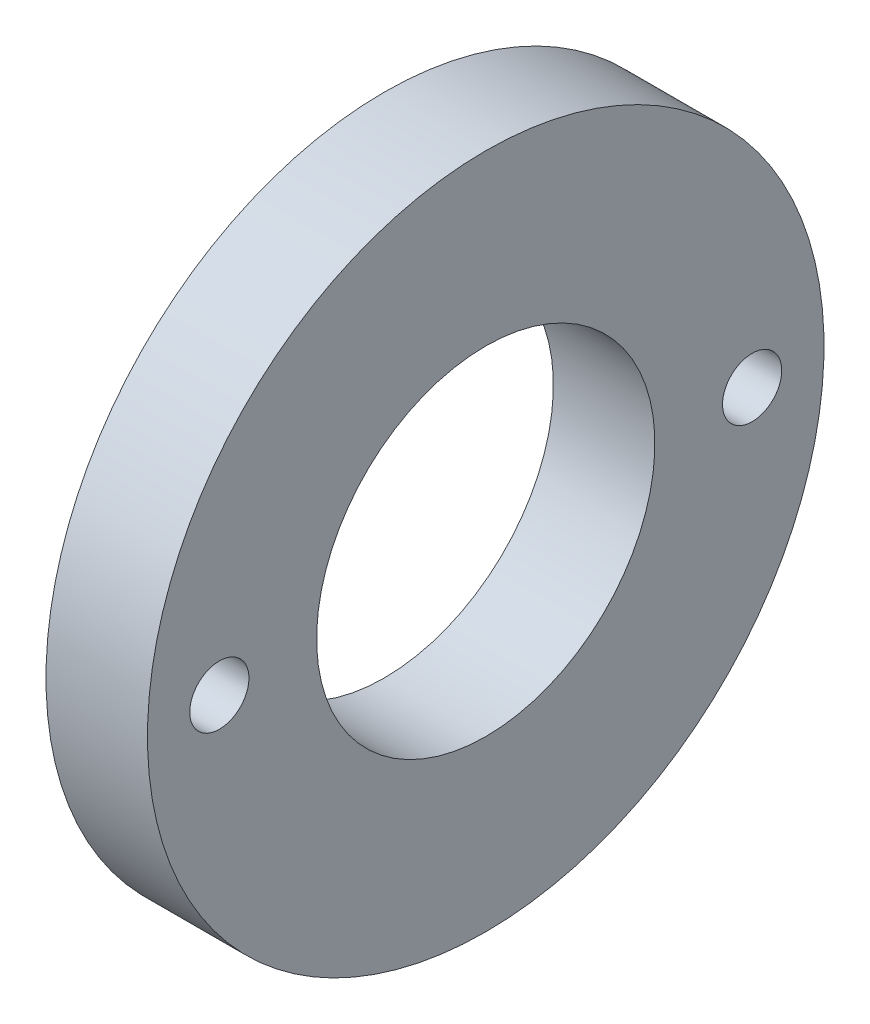
ISO-10303-21;
HEADER;
FILE_DESCRIPTION(('STEP AP214'),'2;1');
FILE_NAME('part.step','',(''),(''),'','','');
FILE_SCHEMA(('AUTOMOTIVE_DESIGN { 1 0 10303 214 1 1 1 1 }'));
ENDSEC;
DATA;
#1=APPLICATION_CONTEXT('core data for automotive mechanical design processes');
#2=APPLICATION_PROTOCOL_DEFINITION('international standard','automotive_design',2000,#1);
#3=PRODUCT_CONTEXT('',#1,'mechanical');
#4=PRODUCT('Part','Part','',(#3));
#5=PRODUCT_RELATED_PRODUCT_CATEGORY('part','',(#4));
#6=PRODUCT_DEFINITION_FORMATION('','',#4);
#7=PRODUCT_DEFINITION_CONTEXT('part definition',#1,'design');
#8=PRODUCT_DEFINITION('design','',#6,#7);
#9=PRODUCT_DEFINITION_SHAPE('','',#8);
#10=(LENGTH_UNIT() NAMED_UNIT(*) SI_UNIT(.MILLI.,.METRE.));
#11=(NAMED_UNIT(*) PLANE_ANGLE_UNIT() SI_UNIT($,.RADIAN.));
#12=(NAMED_UNIT(*) SI_UNIT($,.STERADIAN.) SOLID_ANGLE_UNIT());
#13=UNCERTAINTY_MEASURE_WITH_UNIT(LENGTH_MEASURE(1.E-05),#10,'distance_accuracy_value','');
#14=(GEOMETRIC_REPRESENTATION_CONTEXT(3) GLOBAL_UNCERTAINTY_ASSIGNED_CONTEXT((#13)) GLOBAL_UNIT_ASSIGNED_CONTEXT((#10,
#11,#12)) REPRESENTATION_CONTEXT('',''));
#15=CARTESIAN_POINT('',(0.,0.,0.));
#16=DIRECTION('',(0.,0.,1.));
#17=DIRECTION('',(1.,0.,0.));
#18=AXIS2_PLACEMENT_3D('',#15,#16,#17);
#19=CARTESIAN_POINT('',(3.,0.,0.));
#20=DIRECTION('',(1.,0.,0.));
#21=DIRECTION('',(0.,1.,0.));
#22=AXIS2_PLACEMENT_3D('',#19,#20,#21);
#23=PLANE('',#22);
#24=CARTESIAN_POINT('',(3.,0.,15.75));
#25=DIRECTION('',(-1.,0.,0.));
#26=DIRECTION('',(0.,-1.,0.));
#27=AXIS2_PLACEMENT_3D('',#24,#25,#26);
#28=CIRCLE('',#27,1.75);
#29=CARTESIAN_POINT('',(3.,1.75,15.75));
#30=VERTEX_POINT('',#29);
#31=EDGE_CURVE('E90',#30,#30,#28,.T.);
#32=ORIENTED_EDGE('',*,*,#31,.T.);
#33=EDGE_LOOP('',(#32));
#34=FACE_BOUND('',#33,.T.);
#35=CARTESIAN_POINT('',(3.,0.,0.));
#36=DIRECTION('',(-1.,0.,0.));
#37=DIRECTION('',(0.,-1.,0.));
#38=AXIS2_PLACEMENT_3D('',#35,#36,#37);
#39=CIRCLE('',#38,10.);
#40=CARTESIAN_POINT('',(3.,10.,0.));
#41=VERTEX_POINT('',#40);
#42=EDGE_CURVE('E78',#41,#41,#39,.T.);
#43=ORIENTED_EDGE('',*,*,#42,.T.);
#44=EDGE_LOOP('',(#43));
#45=FACE_BOUND('',#44,.T.);
#46=CARTESIAN_POINT('',(3.,0.,-15.75));
#47=DIRECTION('',(-1.,0.,0.));
#48=DIRECTION('',(0.,-1.,0.));
#49=AXIS2_PLACEMENT_3D('',#46,#47,#48);
#50=CIRCLE('',#49,1.75);
#51=CARTESIAN_POINT('',(3.,1.75,-15.75));
#52=VERTEX_POINT('',#51);
#53=EDGE_CURVE('E81',#52,#52,#50,.T.);
#54=ORIENTED_EDGE('',*,*,#53,.T.);
#55=EDGE_LOOP('',(#54));
#56=FACE_BOUND('',#55,.T.);
#57=CARTESIAN_POINT('',(3.,0.,0.));
#58=DIRECTION('',(1.,0.,0.));
#59=DIRECTION('',(0.,1.,0.));
#60=AXIS2_PLACEMENT_3D('',#57,#58,#59);
#61=CIRCLE('',#60,20.);
#62=CARTESIAN_POINT('',(3.,-20.,0.));
#63=VERTEX_POINT('',#62);
#64=EDGE_CURVE('E19',#63,#63,#61,.T.);
#65=ORIENTED_EDGE('',*,*,#64,.T.);
#66=EDGE_LOOP('',(#65));
#67=FACE_BOUND('',#66,.T.);
#68=ADVANCED_FACE('F15',(#34,#45,#56,#67),#23,.T.);
#69=CARTESIAN_POINT('',(0.,0.,0.));
#70=DIRECTION('',(1.,0.,0.));
#71=DIRECTION('',(0.,1.,0.));
#72=AXIS2_PLACEMENT_3D('',#69,#70,#71);
#73=CYLINDRICAL_SURFACE('',#72,20.);
#74=ORIENTED_EDGE('',*,*,#64,.F.);
#75=DIRECTION('',(-1.,0.,0.));
#76=VECTOR('',#75,1.);
#77=CARTESIAN_POINT('',(0.,-20.,0.));
#78=LINE('',#77,#76);
#79=CARTESIAN_POINT('',(-3.,-20.,0.));
#80=VERTEX_POINT('',#79);
#81=EDGE_CURVE('E10',#63,#80,#78,.T.);
#82=ORIENTED_EDGE('',*,*,#81,.T.);
#83=CARTESIAN_POINT('',(-3.,0.,0.));
#84=DIRECTION('',(-1.,0.,0.));
#85=DIRECTION('',(0.,1.,0.));
#86=AXIS2_PLACEMENT_3D('',#83,#84,#85);
#87=CIRCLE('',#86,20.);
#88=EDGE_CURVE('E108',#80,#80,#87,.T.);
#89=ORIENTED_EDGE('',*,*,#88,.F.);
#90=ORIENTED_EDGE('',*,*,#81,.F.);
#91=EDGE_LOOP('',(#74,#82,#89,#90));
#92=FACE_BOUND('',#91,.T.);
#93=ADVANCED_FACE('F127',(#92),#73,.T.);
#94=CARTESIAN_POINT('',(0.,0.,-15.75));
#95=DIRECTION('',(1.,0.,0.));
#96=DIRECTION('',(0.,-1.,0.));
#97=AXIS2_PLACEMENT_3D('',#94,#95,#96);
#98=CYLINDRICAL_SURFACE('',#97,1.75);
#99=ORIENTED_EDGE('',*,*,#53,.F.);
#100=DIRECTION('',(-1.,0.,0.));
#101=VECTOR('',#100,1.);
#102=CARTESIAN_POINT('',(0.,1.75,-15.75));
#103=LINE('',#102,#101);
#104=CARTESIAN_POINT('',(-3.,1.75,-15.75));
#105=VERTEX_POINT('',#104);
#106=EDGE_CURVE('E93',#52,#105,#103,.T.);
#107=ORIENTED_EDGE('',*,*,#106,.T.);
#108=CARTESIAN_POINT('',(-3.,0.,-15.75));
#109=DIRECTION('',(1.,0.,0.));
#110=DIRECTION('',(0.,-1.,0.));
#111=AXIS2_PLACEMENT_3D('',#108,#109,#110);
#112=CIRCLE('',#111,1.75);
#113=EDGE_CURVE('E100',#105,#105,#112,.T.);
#114=ORIENTED_EDGE('',*,*,#113,.F.);
#115=ORIENTED_EDGE('',*,*,#106,.F.);
#116=EDGE_LOOP('',(#99,#107,#114,#115));
#117=FACE_BOUND('',#116,.T.);
#118=ADVANCED_FACE('F125',(#117),#98,.F.);
#119=CARTESIAN_POINT('',(0.,0.,0.));
#120=DIRECTION('',(1.,0.,0.));
#121=DIRECTION('',(0.,-1.,0.));
#122=AXIS2_PLACEMENT_3D('',#119,#120,#121);
#123=CYLINDRICAL_SURFACE('',#122,10.);
#124=ORIENTED_EDGE('',*,*,#42,.F.);
#125=DIRECTION('',(-1.,0.,0.));
#126=VECTOR('',#125,1.);
#127=CARTESIAN_POINT('',(0.,10.,0.));
#128=LINE('',#127,#126);
#129=CARTESIAN_POINT('',(-3.,10.,0.));
#130=VERTEX_POINT('',#129);
#131=EDGE_CURVE('E58',#41,#130,#128,.T.);
#132=ORIENTED_EDGE('',*,*,#131,.T.);
#133=CARTESIAN_POINT('',(-3.,0.,0.));
#134=DIRECTION('',(1.,0.,0.));
#135=DIRECTION('',(0.,-1.,0.));
#136=AXIS2_PLACEMENT_3D('',#133,#134,#135);
#137=CIRCLE('',#136,10.);
#138=EDGE_CURVE('E79',#130,#130,#137,.T.);
#139=ORIENTED_EDGE('',*,*,#138,.F.);
#140=ORIENTED_EDGE('',*,*,#131,.F.);
#141=EDGE_LOOP('',(#124,#132,#139,#140));
#142=FACE_BOUND('',#141,.T.);
#143=ADVANCED_FACE('F17',(#142),#123,.F.);
#144=CARTESIAN_POINT('',(0.,0.,15.75));
#145=DIRECTION('',(1.,0.,0.));
#146=DIRECTION('',(0.,-1.,0.));
#147=AXIS2_PLACEMENT_3D('',#144,#145,#146);
#148=CYLINDRICAL_SURFACE('',#147,1.75);
#149=ORIENTED_EDGE('',*,*,#31,.F.);
#150=DIRECTION('',(-1.,0.,0.));
#151=VECTOR('',#150,1.);
#152=CARTESIAN_POINT('',(0.,1.75,15.75));
#153=LINE('',#152,#151);
#154=CARTESIAN_POINT('',(-3.,1.75,15.75));
#155=VERTEX_POINT('',#154);
#156=EDGE_CURVE('E68',#30,#155,#153,.T.);
#157=ORIENTED_EDGE('',*,*,#156,.T.);
#158=CARTESIAN_POINT('',(-3.,0.,15.75));
#159=DIRECTION('',(1.,0.,0.));
#160=DIRECTION('',(0.,-1.,0.));
#161=AXIS2_PLACEMENT_3D('',#158,#159,#160);
#162=CIRCLE('',#161,1.75);
#163=EDGE_CURVE('E98',#155,#155,#162,.T.);
#164=ORIENTED_EDGE('',*,*,#163,.F.);
#165=ORIENTED_EDGE('',*,*,#156,.F.);
#166=EDGE_LOOP('',(#149,#157,#164,#165));
#167=FACE_BOUND('',#166,.T.);
#168=ADVANCED_FACE('F134',(#167),#148,.F.);
#169=CARTESIAN_POINT('',(-3.,0.,0.));
#170=DIRECTION('',(1.,0.,0.));
#171=DIRECTION('',(0.,1.,0.));
#172=AXIS2_PLACEMENT_3D('',#169,#170,#171);
#173=PLANE('',#172);
#174=ORIENTED_EDGE('',*,*,#163,.T.);
#175=EDGE_LOOP('',(#174));
#176=FACE_BOUND('',#175,.T.);
#177=ORIENTED_EDGE('',*,*,#138,.T.);
#178=EDGE_LOOP('',(#177));
#179=FACE_BOUND('',#178,.T.);
#180=ORIENTED_EDGE('',*,*,#113,.T.);
#181=EDGE_LOOP('',(#180));
#182=FACE_BOUND('',#181,.T.);
#183=ORIENTED_EDGE('',*,*,#88,.T.);
#184=EDGE_LOOP('',(#183));
#185=FACE_BOUND('',#184,.T.);
#186=ADVANCED_FACE('F143',(#176,#179,#182,#185),#173,.F.);
#187=CLOSED_SHELL('',(#68,#93,#118,#143,#168,#186));
#188=MANIFOLD_SOLID_BREP('B1',#187);
#189=ADVANCED_BREP_SHAPE_REPRESENTATION('',(#18,#188),#14);
#190=SHAPE_DEFINITION_REPRESENTATION(#9,#189);
ENDSEC;
END-ISO-10303-21;
